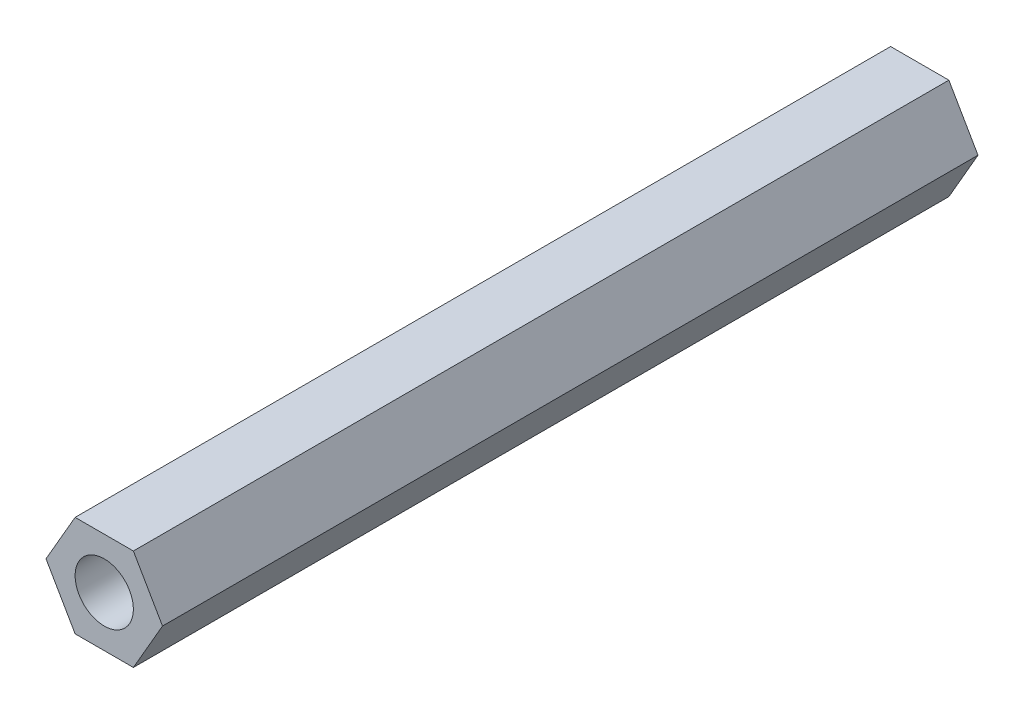
ISO-10303-21;
HEADER;
FILE_DESCRIPTION(('STEP AP214'),'2;1');
FILE_NAME('part.step','',(''),(''),'','','');
FILE_SCHEMA(('AUTOMOTIVE_DESIGN { 1 0 10303 214 1 1 1 1 }'));
ENDSEC;
DATA;
#1=APPLICATION_CONTEXT('core data for automotive mechanical design processes');
#2=APPLICATION_PROTOCOL_DEFINITION('international standard','automotive_design',2000,#1);
#3=PRODUCT_CONTEXT('',#1,'mechanical');
#4=PRODUCT('Part','Part','',(#3));
#5=PRODUCT_RELATED_PRODUCT_CATEGORY('part','',(#4));
#6=PRODUCT_DEFINITION_FORMATION('','',#4);
#7=PRODUCT_DEFINITION_CONTEXT('part definition',#1,'design');
#8=PRODUCT_DEFINITION('design','',#6,#7);
#9=PRODUCT_DEFINITION_SHAPE('','',#8);
#10=(LENGTH_UNIT() NAMED_UNIT(*) SI_UNIT(.MILLI.,.METRE.));
#11=(NAMED_UNIT(*) PLANE_ANGLE_UNIT() SI_UNIT($,.RADIAN.));
#12=(NAMED_UNIT(*) SI_UNIT($,.STERADIAN.) SOLID_ANGLE_UNIT());
#13=UNCERTAINTY_MEASURE_WITH_UNIT(LENGTH_MEASURE(1.E-05),#10,'distance_accuracy_value','');
#14=(GEOMETRIC_REPRESENTATION_CONTEXT(3) GLOBAL_UNCERTAINTY_ASSIGNED_CONTEXT((#13)) GLOBAL_UNIT_ASSIGNED_CONTEXT((#10,
#11,#12)) REPRESENTATION_CONTEXT('',''));
#15=CARTESIAN_POINT('',(0.,0.,0.));
#16=DIRECTION('',(0.,0.,1.));
#17=DIRECTION('',(1.,0.,0.));
#18=AXIS2_PLACEMENT_3D('',#15,#16,#17);
#19=CARTESIAN_POINT('',(-1.25,-2.1650635094611,35.));
#20=DIRECTION('',(0.866025403784439,-0.5,0.));
#21=DIRECTION('',(0.5,0.866025403784439,0.));
#22=AXIS2_PLACEMENT_3D('',#19,#20,#21);
#23=PLANE('',#22);
#24=DIRECTION('',(-0.5,-0.866025403784439,0.));
#25=VECTOR('',#24,1.);
#26=CARTESIAN_POINT('',(-1.25,-2.1650635094611,0.));
#27=LINE('',#26,#25);
#28=CARTESIAN_POINT('',(0.,0.,0.));
#29=VERTEX_POINT('',#28);
#30=CARTESIAN_POINT('',(-1.25,-2.1650635094611,0.));
#31=VERTEX_POINT('',#30);
#32=EDGE_CURVE('E121',#29,#31,#27,.T.);
#33=ORIENTED_EDGE('',*,*,#32,.T.);
#34=DIRECTION('',(0.,0.,-1.));
#35=VECTOR('',#34,1.);
#36=CARTESIAN_POINT('',(-1.25,-2.1650635094611,35.));
#37=LINE('',#36,#35);
#38=CARTESIAN_POINT('',(-1.25,-2.1650635094611,35.));
#39=VERTEX_POINT('',#38);
#40=EDGE_CURVE('E11',#39,#31,#37,.T.);
#41=ORIENTED_EDGE('',*,*,#40,.F.);
#42=DIRECTION('',(-0.5,-0.866025403784439,0.));
#43=VECTOR('',#42,1.);
#44=CARTESIAN_POINT('',(-1.25,-2.1650635094611,35.));
#45=LINE('',#44,#43);
#46=CARTESIAN_POINT('',(0.,0.,35.));
#47=VERTEX_POINT('',#46);
#48=EDGE_CURVE('E132',#47,#39,#45,.T.);
#49=ORIENTED_EDGE('',*,*,#48,.F.);
#50=DIRECTION('',(0.,0.,-1.));
#51=VECTOR('',#50,1.);
#52=CARTESIAN_POINT('',(0.,0.,35.));
#53=LINE('',#52,#51);
#54=EDGE_CURVE('E117',#47,#29,#53,.T.);
#55=ORIENTED_EDGE('',*,*,#54,.T.);
#56=EDGE_LOOP('',(#33,#41,#49,#55));
#57=FACE_BOUND('',#56,.T.);
#58=ADVANCED_FACE('F37',(#57),#23,.F.);
#59=CARTESIAN_POINT('',(0.,-4.33012701892219,35.));
#60=DIRECTION('',(0.866025403784439,0.5,0.));
#61=DIRECTION('',(-0.5,0.866025403784439,0.));
#62=AXIS2_PLACEMENT_3D('',#59,#60,#61);
#63=PLANE('',#62);
#64=DIRECTION('',(0.5,-0.866025403784439,0.));
#65=VECTOR('',#64,1.);
#66=CARTESIAN_POINT('',(0.,-4.33012701892219,0.));
#67=LINE('',#66,#65);
#68=CARTESIAN_POINT('',(0.,-4.33012701892219,0.));
#69=VERTEX_POINT('',#68);
#70=EDGE_CURVE('E124',#31,#69,#67,.T.);
#71=ORIENTED_EDGE('',*,*,#70,.T.);
#72=DIRECTION('',(0.,0.,-1.));
#73=VECTOR('',#72,1.);
#74=CARTESIAN_POINT('',(0.,-4.33012701892219,35.));
#75=LINE('',#74,#73);
#76=CARTESIAN_POINT('',(0.,-4.33012701892219,35.));
#77=VERTEX_POINT('',#76);
#78=EDGE_CURVE('E45',#77,#69,#75,.T.);
#79=ORIENTED_EDGE('',*,*,#78,.F.);
#80=DIRECTION('',(0.5,-0.866025403784439,0.));
#81=VECTOR('',#80,1.);
#82=CARTESIAN_POINT('',(0.,-4.33012701892219,35.));
#83=LINE('',#82,#81);
#84=EDGE_CURVE('E90',#39,#77,#83,.T.);
#85=ORIENTED_EDGE('',*,*,#84,.F.);
#86=ORIENTED_EDGE('',*,*,#40,.T.);
#87=EDGE_LOOP('',(#71,#79,#85,#86));
#88=FACE_BOUND('',#87,.T.);
#89=ADVANCED_FACE('F157',(#88),#63,.F.);
#90=CARTESIAN_POINT('',(2.5,-4.33012701892219,35.));
#91=DIRECTION('',(0.,1.,0.));
#92=DIRECTION('',(0.,0.,1.));
#93=AXIS2_PLACEMENT_3D('',#90,#91,#92);
#94=PLANE('',#93);
#95=DIRECTION('',(1.,0.,0.));
#96=VECTOR('',#95,1.);
#97=CARTESIAN_POINT('',(2.5,-4.33012701892219,0.));
#98=LINE('',#97,#96);
#99=CARTESIAN_POINT('',(2.5,-4.33012701892219,0.));
#100=VERTEX_POINT('',#99);
#101=EDGE_CURVE('E127',#69,#100,#98,.T.);
#102=ORIENTED_EDGE('',*,*,#101,.T.);
#103=DIRECTION('',(0.,0.,-1.));
#104=VECTOR('',#103,1.);
#105=CARTESIAN_POINT('',(2.5,-4.33012701892219,35.));
#106=LINE('',#105,#104);
#107=CARTESIAN_POINT('',(2.5,-4.33012701892219,35.));
#108=VERTEX_POINT('',#107);
#109=EDGE_CURVE('E112',#108,#100,#106,.T.);
#110=ORIENTED_EDGE('',*,*,#109,.F.);
#111=DIRECTION('',(1.,0.,0.));
#112=VECTOR('',#111,1.);
#113=CARTESIAN_POINT('',(2.5,-4.33012701892219,35.));
#114=LINE('',#113,#112);
#115=EDGE_CURVE('E103',#77,#108,#114,.T.);
#116=ORIENTED_EDGE('',*,*,#115,.F.);
#117=ORIENTED_EDGE('',*,*,#78,.T.);
#118=EDGE_LOOP('',(#102,#110,#116,#117));
#119=FACE_BOUND('',#118,.T.);
#120=ADVANCED_FACE('F138',(#119),#94,.F.);
#121=CARTESIAN_POINT('',(3.75,-2.1650635094611,35.));
#122=DIRECTION('',(-0.866025403784439,0.5,0.));
#123=DIRECTION('',(-0.5,-0.866025403784439,0.));
#124=AXIS2_PLACEMENT_3D('',#121,#122,#123);
#125=PLANE('',#124);
#126=DIRECTION('',(0.5,0.866025403784439,0.));
#127=VECTOR('',#126,1.);
#128=CARTESIAN_POINT('',(3.75,-2.1650635094611,0.));
#129=LINE('',#128,#127);
#130=CARTESIAN_POINT('',(3.75,-2.1650635094611,0.));
#131=VERTEX_POINT('',#130);
#132=EDGE_CURVE('E111',#100,#131,#129,.T.);
#133=ORIENTED_EDGE('',*,*,#132,.T.);
#134=DIRECTION('',(0.,0.,-1.));
#135=VECTOR('',#134,1.);
#136=CARTESIAN_POINT('',(3.75,-2.1650635094611,35.));
#137=LINE('',#136,#135);
#138=CARTESIAN_POINT('',(3.75,-2.1650635094611,35.));
#139=VERTEX_POINT('',#138);
#140=EDGE_CURVE('E108',#139,#131,#137,.T.);
#141=ORIENTED_EDGE('',*,*,#140,.F.);
#142=DIRECTION('',(0.5,0.866025403784439,0.));
#143=VECTOR('',#142,1.);
#144=CARTESIAN_POINT('',(3.75,-2.1650635094611,35.));
#145=LINE('',#144,#143);
#146=EDGE_CURVE('E97',#108,#139,#145,.T.);
#147=ORIENTED_EDGE('',*,*,#146,.F.);
#148=ORIENTED_EDGE('',*,*,#109,.T.);
#149=EDGE_LOOP('',(#133,#141,#147,#148));
#150=FACE_BOUND('',#149,.T.);
#151=ADVANCED_FACE('F109',(#150),#125,.F.);
#152=CARTESIAN_POINT('',(2.5,0.,35.));
#153=DIRECTION('',(-0.866025403784439,-0.5,0.));
#154=DIRECTION('',(0.5,-0.866025403784439,0.));
#155=AXIS2_PLACEMENT_3D('',#152,#153,#154);
#156=PLANE('',#155);
#157=DIRECTION('',(-0.5,0.866025403784439,0.));
#158=VECTOR('',#157,1.);
#159=CARTESIAN_POINT('',(2.5,0.,0.));
#160=LINE('',#159,#158);
#161=CARTESIAN_POINT('',(2.5,0.,0.));
#162=VERTEX_POINT('',#161);
#163=EDGE_CURVE('E76',#131,#162,#160,.T.);
#164=ORIENTED_EDGE('',*,*,#163,.T.);
#165=DIRECTION('',(0.,0.,-1.));
#166=VECTOR('',#165,1.);
#167=CARTESIAN_POINT('',(2.5,0.,35.));
#168=LINE('',#167,#166);
#169=CARTESIAN_POINT('',(2.5,0.,35.));
#170=VERTEX_POINT('',#169);
#171=EDGE_CURVE('E113',#170,#162,#168,.T.);
#172=ORIENTED_EDGE('',*,*,#171,.F.);
#173=DIRECTION('',(-0.5,0.866025403784439,0.));
#174=VECTOR('',#173,1.);
#175=CARTESIAN_POINT('',(2.5,0.,35.));
#176=LINE('',#175,#174);
#177=EDGE_CURVE('E101',#139,#170,#176,.T.);
#178=ORIENTED_EDGE('',*,*,#177,.F.);
#179=ORIENTED_EDGE('',*,*,#140,.T.);
#180=EDGE_LOOP('',(#164,#172,#178,#179));
#181=FACE_BOUND('',#180,.T.);
#182=ADVANCED_FACE('F115',(#181),#156,.F.);
#183=CARTESIAN_POINT('',(0.,0.,35.));
#184=DIRECTION('',(0.,-1.,0.));
#185=DIRECTION('',(0.,0.,-1.));
#186=AXIS2_PLACEMENT_3D('',#183,#184,#185);
#187=PLANE('',#186);
#188=DIRECTION('',(-1.,0.,0.));
#189=VECTOR('',#188,1.);
#190=CARTESIAN_POINT('',(0.,0.,0.));
#191=LINE('',#190,#189);
#192=EDGE_CURVE('E82',#162,#29,#191,.T.);
#193=ORIENTED_EDGE('',*,*,#192,.T.);
#194=ORIENTED_EDGE('',*,*,#54,.F.);
#195=DIRECTION('',(-1.,0.,0.));
#196=VECTOR('',#195,1.);
#197=CARTESIAN_POINT('',(0.,0.,35.));
#198=LINE('',#197,#196);
#199=EDGE_CURVE('E53',#170,#47,#198,.T.);
#200=ORIENTED_EDGE('',*,*,#199,.F.);
#201=ORIENTED_EDGE('',*,*,#171,.T.);
#202=EDGE_LOOP('',(#193,#194,#200,#201));
#203=FACE_BOUND('',#202,.T.);
#204=ADVANCED_FACE('F145',(#203),#187,.F.);
#205=CARTESIAN_POINT('',(0.,0.,35.));
#206=DIRECTION('',(0.,0.,-1.));
#207=DIRECTION('',(-1.,0.,0.));
#208=AXIS2_PLACEMENT_3D('',#205,#206,#207);
#209=PLANE('',#208);
#210=CARTESIAN_POINT('',(1.25,-2.1650635094611,35.));
#211=DIRECTION('',(0.,0.,1.));
#212=DIRECTION('',(1.,0.,0.));
#213=AXIS2_PLACEMENT_3D('',#210,#211,#212);
#214=CIRCLE('',#213,1.24999999999999);
#215=CARTESIAN_POINT('',(2.49999999999999,-2.1650635094611,35.));
#216=VERTEX_POINT('',#215);
#217=EDGE_CURVE('E214',#216,#216,#214,.T.);
#218=ORIENTED_EDGE('',*,*,#217,.F.);
#219=EDGE_LOOP('',(#218));
#220=FACE_BOUND('',#219,.T.);
#221=ORIENTED_EDGE('',*,*,#48,.T.);
#222=ORIENTED_EDGE('',*,*,#84,.T.);
#223=ORIENTED_EDGE('',*,*,#115,.T.);
#224=ORIENTED_EDGE('',*,*,#146,.T.);
#225=ORIENTED_EDGE('',*,*,#177,.T.);
#226=ORIENTED_EDGE('',*,*,#199,.T.);
#227=EDGE_LOOP('',(#221,#222,#223,#224,#225,#226));
#228=FACE_BOUND('',#227,.T.);
#229=ADVANCED_FACE('F99',(#220,#228),#209,.F.);
#230=CARTESIAN_POINT('',(0.,0.,0.));
#231=DIRECTION('',(0.,0.,-1.));
#232=DIRECTION('',(-1.,0.,0.));
#233=AXIS2_PLACEMENT_3D('',#230,#231,#232);
#234=PLANE('',#233);
#235=CARTESIAN_POINT('',(1.25,-2.1650635094611,0.));
#236=DIRECTION('',(0.,0.,1.));
#237=DIRECTION('',(1.,0.,0.));
#238=AXIS2_PLACEMENT_3D('',#235,#236,#237);
#239=CIRCLE('',#238,1.24999999999999);
#240=CARTESIAN_POINT('',(2.49999999999999,-2.1650635094611,0.));
#241=VERTEX_POINT('',#240);
#242=EDGE_CURVE('E125',#241,#241,#239,.T.);
#243=ORIENTED_EDGE('',*,*,#242,.T.);
#244=EDGE_LOOP('',(#243));
#245=FACE_BOUND('',#244,.T.);
#246=ORIENTED_EDGE('',*,*,#32,.F.);
#247=ORIENTED_EDGE('',*,*,#192,.F.);
#248=ORIENTED_EDGE('',*,*,#163,.F.);
#249=ORIENTED_EDGE('',*,*,#132,.F.);
#250=ORIENTED_EDGE('',*,*,#101,.F.);
#251=ORIENTED_EDGE('',*,*,#70,.F.);
#252=EDGE_LOOP('',(#246,#247,#248,#249,#250,#251));
#253=FACE_BOUND('',#252,.T.);
#254=ADVANCED_FACE('F141',(#245,#253),#234,.T.);
#255=CARTESIAN_POINT('',(1.25,-2.1650635094611,35.));
#256=DIRECTION('',(0.,0.,1.));
#257=DIRECTION('',(1.,0.,0.));
#258=AXIS2_PLACEMENT_3D('',#255,#256,#257);
#259=CYLINDRICAL_SURFACE('',#258,1.24999999999999);
#260=ORIENTED_EDGE('',*,*,#242,.F.);
#261=EDGE_LOOP('',(#260));
#262=FACE_BOUND('',#261,.T.);
#263=ORIENTED_EDGE('',*,*,#217,.T.);
#264=EDGE_LOOP('',(#263));
#265=FACE_BOUND('',#264,.T.);
#266=ADVANCED_FACE('F194',(#262,#265),#259,.F.);
#267=CLOSED_SHELL('',(#58,#89,#120,#151,#182,#204,#229,#254,#266));
#268=MANIFOLD_SOLID_BREP('B2',#267);
#269=ADVANCED_BREP_SHAPE_REPRESENTATION('',(#18,#268),#14);
#270=SHAPE_DEFINITION_REPRESENTATION(#9,#269);
ENDSEC;
END-ISO-10303-21;
